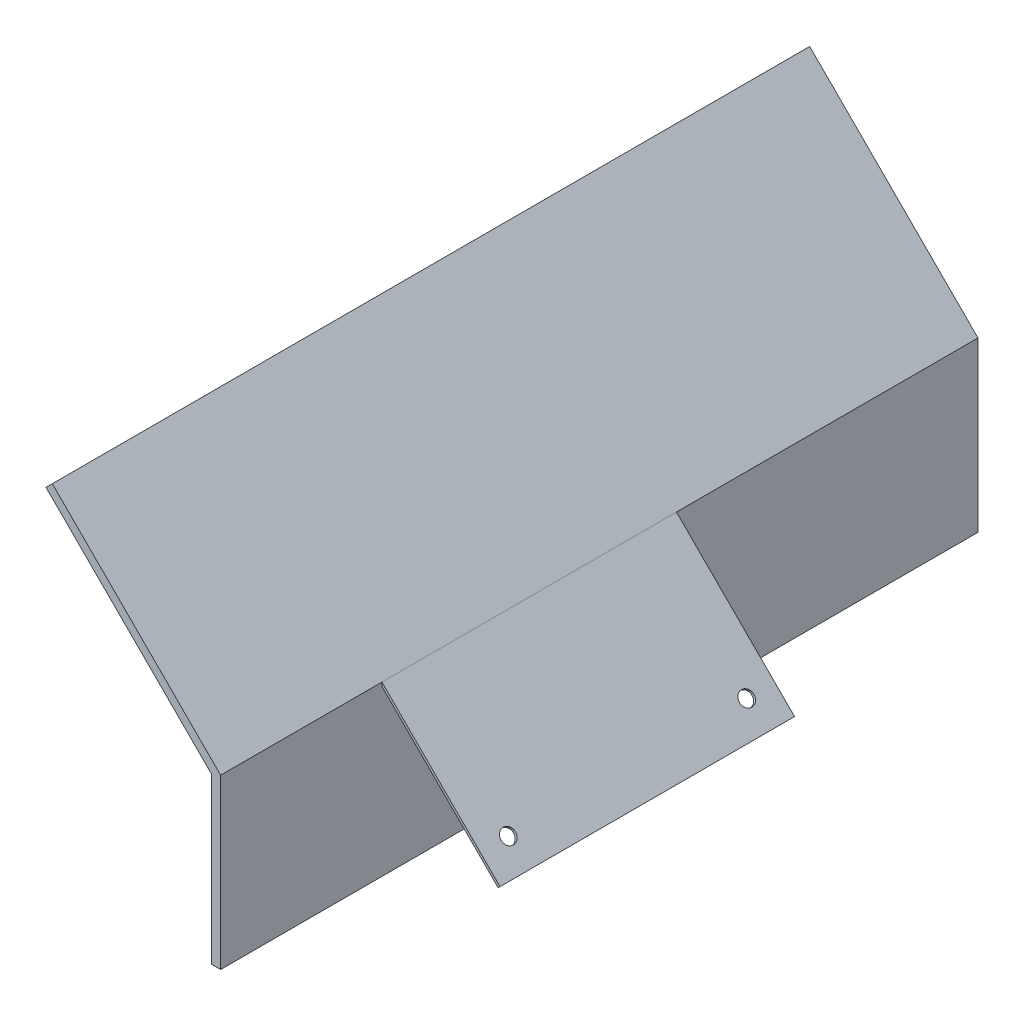
ISO-10303-21;
HEADER;
FILE_DESCRIPTION(('STEP AP214'),'2;1');
FILE_NAME('part.step','',(''),(''),'','','');
FILE_SCHEMA(('AUTOMOTIVE_DESIGN { 1 0 10303 214 1 1 1 1 }'));
ENDSEC;
DATA;
#1=APPLICATION_CONTEXT('core data for automotive mechanical design processes');
#2=APPLICATION_PROTOCOL_DEFINITION('international standard','automotive_design',2000,#1);
#3=PRODUCT_CONTEXT('',#1,'mechanical');
#4=PRODUCT('Part','Part','',(#3));
#5=PRODUCT_RELATED_PRODUCT_CATEGORY('part','',(#4));
#6=PRODUCT_DEFINITION_FORMATION('','',#4);
#7=PRODUCT_DEFINITION_CONTEXT('part definition',#1,'design');
#8=PRODUCT_DEFINITION('design','',#6,#7);
#9=PRODUCT_DEFINITION_SHAPE('','',#8);
#10=(LENGTH_UNIT() NAMED_UNIT(*) SI_UNIT(.MILLI.,.METRE.));
#11=(NAMED_UNIT(*) PLANE_ANGLE_UNIT() SI_UNIT($,.RADIAN.));
#12=(NAMED_UNIT(*) SI_UNIT($,.STERADIAN.) SOLID_ANGLE_UNIT());
#13=UNCERTAINTY_MEASURE_WITH_UNIT(LENGTH_MEASURE(1.E-05),#10,'distance_accuracy_value','');
#14=(GEOMETRIC_REPRESENTATION_CONTEXT(3) GLOBAL_UNCERTAINTY_ASSIGNED_CONTEXT((#13)) GLOBAL_UNIT_ASSIGNED_CONTEXT((#10,
#11,#12)) REPRESENTATION_CONTEXT('',''));
#15=CARTESIAN_POINT('',(0.,0.,0.));
#16=DIRECTION('',(0.,0.,1.));
#17=DIRECTION('',(1.,0.,0.));
#18=AXIS2_PLACEMENT_3D('',#15,#16,#17);
#19=CARTESIAN_POINT('',(-44.1236816385379,-78.9253169424674,-73.025));
#20=DIRECTION('',(0.,0.,-1.));
#21=DIRECTION('',(-0.707106781186546,-0.707106781186549,0.));
#22=AXIS2_PLACEMENT_3D('',#19,#20,#21);
#23=PLANE('',#22);
#24=DIRECTION('',(-0.707106781186549,0.707106781186546,0.));
#25=VECTOR('',#24,1.);
#26=CARTESIAN_POINT('',(57.5328176519647,22.7311823480355,-73.025));
#27=LINE('',#26,#25);
#28=CARTESIAN_POINT('',(57.5328176519647,22.7311823480355,-73.025));
#29=VERTEX_POINT('',#28);
#30=CARTESIAN_POINT('',(3.33641809728114,76.9275819027189,-73.025));
#31=VERTEX_POINT('',#30);
#32=EDGE_CURVE('E186',#29,#31,#27,.T.);
#33=ORIENTED_EDGE('',*,*,#32,.T.);
#34=DIRECTION('',(1.,0.,0.));
#35=VECTOR('',#34,1.);
#36=CARTESIAN_POINT('',(-139.7,76.9275819027189,-73.025));
#37=LINE('',#36,#35);
#38=CARTESIAN_POINT('',(1.61939312693272,76.9275819027189,-73.025));
#39=VERTEX_POINT('',#38);
#40=EDGE_CURVE('E150',#39,#31,#37,.T.);
#41=ORIENTED_EDGE('',*,*,#40,.F.);
#42=DIRECTION('',(-0.707106781186549,0.707106781186546,0.));
#43=VECTOR('',#42,1.);
#44=CARTESIAN_POINT('',(56.6743051667905,21.8726698628613,-73.025));
#45=LINE('',#44,#43);
#46=CARTESIAN_POINT('',(56.6743051667905,21.8726698628613,-73.025));
#47=VERTEX_POINT('',#46);
#48=EDGE_CURVE('E149',#47,#39,#45,.T.);
#49=ORIENTED_EDGE('',*,*,#48,.F.);
#50=DIRECTION('',(0.707106781186546,0.707106781186549,0.));
#51=VECTOR('',#50,1.);
#52=CARTESIAN_POINT('',(-44.1236816385379,-78.9253169424674,-73.025));
#53=LINE('',#52,#51);
#54=EDGE_CURVE('E183',#47,#29,#53,.T.);
#55=ORIENTED_EDGE('',*,*,#54,.T.);
#56=EDGE_LOOP('',(#33,#41,#49,#55));
#57=FACE_BOUND('',#56,.T.);
#58=ADVANCED_FACE('F59',(#57),#23,.F.);
#59=CARTESIAN_POINT('',(57.5328176519647,22.7311823480355,-342.9));
#60=DIRECTION('',(-0.707106781186549,0.707106781186546,0.));
#61=DIRECTION('',(0.,0.,1.));
#62=AXIS2_PLACEMENT_3D('',#59,#60,#61);
#63=PLANE('',#62);
#64=DIRECTION('',(0.707106781186546,0.707106781186549,0.));
#65=VECTOR('',#64,1.);
#66=CARTESIAN_POINT('',(-44.1236816385379,-78.9253169424675,-206.375));
#67=LINE('',#66,#65);
#68=CARTESIAN_POINT('',(56.6743051667905,21.8726698628613,-206.375));
#69=VERTEX_POINT('',#68);
#70=CARTESIAN_POINT('',(57.5328176519647,22.7311823480355,-206.375));
#71=VERTEX_POINT('',#70);
#72=EDGE_CURVE('E177',#69,#71,#67,.T.);
#73=ORIENTED_EDGE('',*,*,#72,.T.);
#74=DIRECTION('',(0.,0.,1.));
#75=VECTOR('',#74,1.);
#76=CARTESIAN_POINT('',(57.5328176519647,22.7311823480355,-342.9));
#77=LINE('',#76,#75);
#78=EDGE_CURVE('E13',#71,#29,#77,.T.);
#79=ORIENTED_EDGE('',*,*,#78,.T.);
#80=ORIENTED_EDGE('',*,*,#54,.F.);
#81=DIRECTION('',(0.,0.,1.));
#82=VECTOR('',#81,1.);
#83=CARTESIAN_POINT('',(56.6743051667905,21.8726698628613,-342.9));
#84=LINE('',#83,#82);
#85=EDGE_CURVE('E63',#69,#47,#84,.T.);
#86=ORIENTED_EDGE('',*,*,#85,.F.);
#87=EDGE_LOOP('',(#73,#79,#80,#86));
#88=FACE_BOUND('',#87,.T.);
#89=ADVANCED_FACE('F226',(#88),#63,.F.);
#90=CARTESIAN_POINT('',(4.06400000000002,76.2,-342.9));
#91=DIRECTION('',(0.707106781186546,0.707106781186549,0.));
#92=DIRECTION('',(-0.707106781186549,0.707106781186546,0.));
#93=AXIS2_PLACEMENT_3D('',#90,#91,#92);
#94=PLANE('',#93);
#95=CARTESIAN_POINT('',(48.5525615308955,31.7114384691047,-193.675));
#96=DIRECTION('',(0.707106781186546,0.707106781186549,0.));
#97=DIRECTION('',(-0.707106781186549,0.707106781186546,0.));
#98=AXIS2_PLACEMENT_3D('',#95,#96,#97);
#99=CIRCLE('',#98,3.26389999999998);
#100=CARTESIAN_POINT('',(46.2446357077808,34.0193642922194,-193.675));
#101=VERTEX_POINT('',#100);
#102=EDGE_CURVE('E174',#101,#101,#99,.T.);
#103=ORIENTED_EDGE('',*,*,#102,.F.);
#104=EDGE_LOOP('',(#103));
#105=FACE_BOUND('',#104,.T.);
#106=CARTESIAN_POINT('',(48.5525615308955,31.7114384691047,-85.725));
#107=DIRECTION('',(0.707106781186546,0.707106781186549,0.));
#108=DIRECTION('',(-0.707106781186549,0.707106781186546,0.));
#109=AXIS2_PLACEMENT_3D('',#106,#107,#108);
#110=CIRCLE('',#109,3.26389999999999);
#111=CARTESIAN_POINT('',(46.2446357077808,34.0193642922194,-85.725));
#112=VERTEX_POINT('',#111);
#113=EDGE_CURVE('E167',#112,#112,#110,.T.);
#114=ORIENTED_EDGE('',*,*,#113,.F.);
#115=EDGE_LOOP('',(#114));
#116=FACE_BOUND('',#115,.T.);
#117=DIRECTION('',(0.707106781186549,-0.707106781186546,0.));
#118=VECTOR('',#117,1.);
#119=CARTESIAN_POINT('',(57.5328176519647,22.7311823480355,-206.375));
#120=LINE('',#119,#118);
#121=CARTESIAN_POINT('',(3.33641809728114,76.9275819027189,-206.375));
#122=VERTEX_POINT('',#121);
#123=EDGE_CURVE('E181',#122,#71,#120,.T.);
#124=ORIENTED_EDGE('',*,*,#123,.F.);
#125=DIRECTION('',(0.,0.,1.));
#126=VECTOR('',#125,1.);
#127=CARTESIAN_POINT('',(3.33641809728114,76.9275819027189,-342.9));
#128=LINE('',#127,#126);
#129=CARTESIAN_POINT('',(3.33641809728114,76.9275819027189,-279.4));
#130=VERTEX_POINT('',#129);
#131=EDGE_CURVE('E191',#122,#130,#128,.F.);
#132=ORIENTED_EDGE('',*,*,#131,.T.);
#133=DIRECTION('',(0.707106781186549,-0.707106781186546,0.));
#134=VECTOR('',#133,1.);
#135=CARTESIAN_POINT('',(4.06400000000002,76.2,-279.4));
#136=LINE('',#135,#134);
#137=CARTESIAN_POINT('',(-72.1360000000002,152.4,-279.4));
#138=VERTEX_POINT('',#137);
#139=EDGE_CURVE('E155',#138,#130,#136,.T.);
#140=ORIENTED_EDGE('',*,*,#139,.F.);
#141=DIRECTION('',(0.,0.,1.));
#142=VECTOR('',#141,1.);
#143=CARTESIAN_POINT('',(-72.1360000000002,152.4,-342.9));
#144=LINE('',#143,#142);
#145=CARTESIAN_POINT('',(-72.1360000000002,152.4,-25.4));
#146=VERTEX_POINT('',#145);
#147=EDGE_CURVE('E171',#138,#146,#144,.T.);
#148=ORIENTED_EDGE('',*,*,#147,.T.);
#149=DIRECTION('',(-0.707106781186549,0.707106781186546,0.));
#150=VECTOR('',#149,1.);
#151=CARTESIAN_POINT('',(4.06400000000004,76.2,-25.4));
#152=LINE('',#151,#150);
#153=CARTESIAN_POINT('',(3.33641809728115,76.9275819027189,-25.4));
#154=VERTEX_POINT('',#153);
#155=EDGE_CURVE('E145',#154,#146,#152,.T.);
#156=ORIENTED_EDGE('',*,*,#155,.F.);
#157=EDGE_CURVE('E144',#154,#31,#128,.F.);
#158=ORIENTED_EDGE('',*,*,#157,.T.);
#159=ORIENTED_EDGE('',*,*,#32,.F.);
#160=ORIENTED_EDGE('',*,*,#78,.F.);
#161=EDGE_LOOP('',(#124,#132,#140,#148,#156,#158,#159,#160));
#162=FACE_BOUND('',#161,.T.);
#163=ADVANCED_FACE('F61',(#105,#116,#162),#94,.T.);
#164=CARTESIAN_POINT('',(56.6743051667905,21.8726698628613,-342.9));
#165=DIRECTION('',(0.707106781186546,0.707106781186549,0.));
#166=DIRECTION('',(-0.707106781186549,0.707106781186546,0.));
#167=AXIS2_PLACEMENT_3D('',#164,#165,#166);
#168=PLANE('',#167);
#169=CARTESIAN_POINT('',(47.6940490457213,30.8529259839304,-193.675));
#170=DIRECTION('',(-0.707106781186546,-0.707106781186549,0.));
#171=DIRECTION('',(0.707106781186549,-0.707106781186546,0.));
#172=AXIS2_PLACEMENT_3D('',#169,#170,#171);
#173=CIRCLE('',#172,3.26389999999998);
#174=CARTESIAN_POINT('',(50.0019748688361,28.5450001608157,-193.675));
#175=VERTEX_POINT('',#174);
#176=EDGE_CURVE('E164',#175,#175,#173,.T.);
#177=ORIENTED_EDGE('',*,*,#176,.F.);
#178=EDGE_LOOP('',(#177));
#179=FACE_BOUND('',#178,.T.);
#180=CARTESIAN_POINT('',(47.6940490457213,30.8529259839304,-85.725));
#181=DIRECTION('',(-0.707106781186546,-0.707106781186549,0.));
#182=DIRECTION('',(0.707106781186549,-0.707106781186546,0.));
#183=AXIS2_PLACEMENT_3D('',#180,#181,#182);
#184=CIRCLE('',#183,3.26389999999999);
#185=CARTESIAN_POINT('',(50.0019748688361,28.5450001608157,-85.725));
#186=VERTEX_POINT('',#185);
#187=EDGE_CURVE('E168',#186,#186,#184,.T.);
#188=ORIENTED_EDGE('',*,*,#187,.F.);
#189=EDGE_LOOP('',(#188));
#190=FACE_BOUND('',#189,.T.);
#191=ORIENTED_EDGE('',*,*,#48,.T.);
#192=DIRECTION('',(0.,0.,-1.));
#193=VECTOR('',#192,1.);
#194=CARTESIAN_POINT('',(1.61939312693272,76.9275819027189,-342.9));
#195=LINE('',#194,#193);
#196=CARTESIAN_POINT('',(1.61939312693272,76.9275819027189,-25.4));
#197=VERTEX_POINT('',#196);
#198=EDGE_CURVE('E141',#197,#39,#195,.T.);
#199=ORIENTED_EDGE('',*,*,#198,.F.);
#200=DIRECTION('',(-0.707106781186549,0.707106781186546,0.));
#201=VECTOR('',#200,1.);
#202=CARTESIAN_POINT('',(3.20548751482583,75.3414875148258,-25.4));
#203=LINE('',#202,#201);
#204=CARTESIAN_POINT('',(-72.9945124851744,151.541487514826,-25.4));
#205=VERTEX_POINT('',#204);
#206=EDGE_CURVE('E123',#197,#205,#203,.T.);
#207=ORIENTED_EDGE('',*,*,#206,.T.);
#208=DIRECTION('',(0.,0.,1.));
#209=VECTOR('',#208,1.);
#210=CARTESIAN_POINT('',(-72.9945124851745,151.541487514826,-342.9));
#211=LINE('',#210,#209);
#212=CARTESIAN_POINT('',(-72.9945124851745,151.541487514826,-279.4));
#213=VERTEX_POINT('',#212);
#214=EDGE_CURVE('E162',#213,#205,#211,.T.);
#215=ORIENTED_EDGE('',*,*,#214,.F.);
#216=DIRECTION('',(0.707106781186549,-0.707106781186546,0.));
#217=VECTOR('',#216,1.);
#218=CARTESIAN_POINT('',(3.20548751482581,75.3414875148258,-279.4));
#219=LINE('',#218,#217);
#220=CARTESIAN_POINT('',(1.61939312693272,76.9275819027189,-279.4));
#221=VERTEX_POINT('',#220);
#222=EDGE_CURVE('E133',#213,#221,#219,.T.);
#223=ORIENTED_EDGE('',*,*,#222,.T.);
#224=DIRECTION('',(0.,0.,1.));
#225=VECTOR('',#224,1.);
#226=CARTESIAN_POINT('',(1.61939312693272,76.9275819027189,-342.9));
#227=LINE('',#226,#225);
#228=CARTESIAN_POINT('',(1.61939312693273,76.9275819027189,-206.375));
#229=VERTEX_POINT('',#228);
#230=EDGE_CURVE('E146',#221,#229,#227,.T.);
#231=ORIENTED_EDGE('',*,*,#230,.T.);
#232=DIRECTION('',(0.707106781186549,-0.707106781186546,0.));
#233=VECTOR('',#232,1.);
#234=CARTESIAN_POINT('',(56.6743051667905,21.8726698628613,-206.375));
#235=LINE('',#234,#233);
#236=EDGE_CURVE('E179',#229,#69,#235,.T.);
#237=ORIENTED_EDGE('',*,*,#236,.T.);
#238=ORIENTED_EDGE('',*,*,#85,.T.);
#239=EDGE_LOOP('',(#191,#199,#207,#215,#223,#231,#237,#238));
#240=FACE_BOUND('',#239,.T.);
#241=ADVANCED_FACE('F148',(#179,#190,#240),#168,.F.);
#242=CARTESIAN_POINT('',(-44.1236816385379,-78.9253169424675,-206.375));
#243=DIRECTION('',(0.,0.,1.));
#244=DIRECTION('',(0.707106781186546,0.707106781186549,0.));
#245=AXIS2_PLACEMENT_3D('',#242,#243,#244);
#246=PLANE('',#245);
#247=ORIENTED_EDGE('',*,*,#236,.F.);
#248=DIRECTION('',(1.,0.,0.));
#249=VECTOR('',#248,1.);
#250=CARTESIAN_POINT('',(-139.7,76.9275819027189,-206.375));
#251=LINE('',#250,#249);
#252=EDGE_CURVE('E134',#229,#122,#251,.T.);
#253=ORIENTED_EDGE('',*,*,#252,.T.);
#254=ORIENTED_EDGE('',*,*,#123,.T.);
#255=ORIENTED_EDGE('',*,*,#72,.F.);
#256=EDGE_LOOP('',(#247,#253,#254,#255));
#257=FACE_BOUND('',#256,.T.);
#258=ADVANCED_FACE('F205',(#257),#246,.F.);
#259=CARTESIAN_POINT('',(254.239939830311,237.398816768521,-85.725));
#260=DIRECTION('',(-0.707106781186546,-0.707106781186549,0.));
#261=DIRECTION('',(0.707106781186549,-0.707106781186546,0.));
#262=AXIS2_PLACEMENT_3D('',#259,#260,#261);
#263=CYLINDRICAL_SURFACE('',#262,3.26389999999999);
#264=ORIENTED_EDGE('',*,*,#113,.T.);
#265=EDGE_LOOP('',(#264));
#266=FACE_BOUND('',#265,.T.);
#267=ORIENTED_EDGE('',*,*,#187,.T.);
#268=EDGE_LOOP('',(#267));
#269=FACE_BOUND('',#268,.T.);
#270=ADVANCED_FACE('F235',(#266,#269),#263,.F.);
#271=CARTESIAN_POINT('',(254.239939830311,237.398816768521,-193.675));
#272=DIRECTION('',(-0.707106781186546,-0.707106781186549,0.));
#273=DIRECTION('',(0.707106781186549,-0.707106781186546,0.));
#274=AXIS2_PLACEMENT_3D('',#271,#272,#273);
#275=CYLINDRICAL_SURFACE('',#274,3.26389999999998);
#276=ORIENTED_EDGE('',*,*,#102,.T.);
#277=EDGE_LOOP('',(#276));
#278=FACE_BOUND('',#277,.T.);
#279=ORIENTED_EDGE('',*,*,#176,.T.);
#280=EDGE_LOOP('',(#279));
#281=FACE_BOUND('',#280,.T.);
#282=ADVANCED_FACE('F223',(#278,#281),#275,.F.);
#283=CARTESIAN_POINT('',(-72.1360000000002,152.4,-342.9));
#284=DIRECTION('',(-0.707106781186549,0.707106781186546,0.));
#285=DIRECTION('',(0.,0.,1.));
#286=AXIS2_PLACEMENT_3D('',#283,#284,#285);
#287=PLANE('',#286);
#288=DIRECTION('',(-0.707106781186546,-0.707106781186549,0.));
#289=VECTOR('',#288,1.);
#290=CARTESIAN_POINT('',(-72.1360000000003,152.4,-25.4));
#291=LINE('',#290,#289);
#292=EDGE_CURVE('E129',#146,#205,#291,.T.);
#293=ORIENTED_EDGE('',*,*,#292,.F.);
#294=ORIENTED_EDGE('',*,*,#147,.F.);
#295=DIRECTION('',(0.707106781186546,0.707106781186549,0.));
#296=VECTOR('',#295,1.);
#297=CARTESIAN_POINT('',(-72.1360000000002,152.4,-279.4));
#298=LINE('',#297,#296);
#299=EDGE_CURVE('E160',#213,#138,#298,.T.);
#300=ORIENTED_EDGE('',*,*,#299,.F.);
#301=ORIENTED_EDGE('',*,*,#214,.T.);
#302=EDGE_LOOP('',(#293,#294,#300,#301));
#303=FACE_BOUND('',#302,.T.);
#304=ADVANCED_FACE('F214',(#303),#287,.T.);
#305=CARTESIAN_POINT('',(-75.0096819587424,76.9275819027189,-279.4));
#306=DIRECTION('',(0.,0.,1.));
#307=DIRECTION('',(1.,0.,0.));
#308=AXIS2_PLACEMENT_3D('',#305,#306,#307);
#309=PLANE('',#308);
#310=ORIENTED_EDGE('',*,*,#299,.T.);
#311=ORIENTED_EDGE('',*,*,#139,.T.);
#312=DIRECTION('',(1.,0.,0.));
#313=VECTOR('',#312,1.);
#314=CARTESIAN_POINT('',(-139.7,76.9275819027189,-279.4));
#315=LINE('',#314,#313);
#316=EDGE_CURVE('E151',#221,#130,#315,.T.);
#317=ORIENTED_EDGE('',*,*,#316,.F.);
#318=ORIENTED_EDGE('',*,*,#222,.F.);
#319=EDGE_LOOP('',(#310,#311,#317,#318));
#320=FACE_BOUND('',#319,.T.);
#321=ADVANCED_FACE('F215',(#320),#309,.F.);
#322=CARTESIAN_POINT('',(-139.7,76.9275819027189,-292.1));
#323=DIRECTION('',(0.,1.,0.));
#324=DIRECTION('',(0.,0.,1.));
#325=AXIS2_PLACEMENT_3D('',#322,#323,#324);
#326=PLANE('',#325);
#327=ORIENTED_EDGE('',*,*,#230,.F.);
#328=ORIENTED_EDGE('',*,*,#316,.T.);
#329=ORIENTED_EDGE('',*,*,#131,.F.);
#330=ORIENTED_EDGE('',*,*,#252,.F.);
#331=EDGE_LOOP('',(#327,#328,#329,#330));
#332=FACE_BOUND('',#331,.T.);
#333=ADVANCED_FACE('F208',(#332),#326,.F.);
#334=CARTESIAN_POINT('',(-139.7,76.9275819027189,0.));
#335=DIRECTION('',(0.,-1.,0.));
#336=DIRECTION('',(0.,0.,-1.));
#337=AXIS2_PLACEMENT_3D('',#334,#335,#336);
#338=PLANE('',#337);
#339=DIRECTION('',(1.,0.,0.));
#340=VECTOR('',#339,1.);
#341=CARTESIAN_POINT('',(-139.7,76.9275819027189,-25.4));
#342=LINE('',#341,#340);
#343=EDGE_CURVE('E126',#197,#154,#342,.T.);
#344=ORIENTED_EDGE('',*,*,#343,.F.);
#345=ORIENTED_EDGE('',*,*,#198,.T.);
#346=ORIENTED_EDGE('',*,*,#40,.T.);
#347=ORIENTED_EDGE('',*,*,#157,.F.);
#348=EDGE_LOOP('',(#344,#345,#346,#347));
#349=FACE_BOUND('',#348,.T.);
#350=ADVANCED_FACE('F139',(#349),#338,.T.);
#351=CARTESIAN_POINT('',(-75.0096819587424,152.4,-25.4));
#352=DIRECTION('',(0.,0.,-1.));
#353=DIRECTION('',(0.,1.,0.));
#354=AXIS2_PLACEMENT_3D('',#351,#352,#353);
#355=PLANE('',#354);
#356=ORIENTED_EDGE('',*,*,#343,.T.);
#357=ORIENTED_EDGE('',*,*,#155,.T.);
#358=ORIENTED_EDGE('',*,*,#292,.T.);
#359=ORIENTED_EDGE('',*,*,#206,.F.);
#360=EDGE_LOOP('',(#356,#357,#358,#359));
#361=FACE_BOUND('',#360,.T.);
#362=ADVANCED_FACE('F125',(#361),#355,.F.);
#363=CLOSED_SHELL('',(#58,#89,#163,#241,#258,#270,#282,#304,#321,#333,#350,#362));
#364=MANIFOLD_SOLID_BREP('B2',#363);
#365=CARTESIAN_POINT('',(0.,74.5166360825157,-342.9));
#366=DIRECTION('',(-1.,0.,0.));
#367=DIRECTION('',(0.,0.,1.));
#368=AXIS2_PLACEMENT_3D('',#365,#366,#367);
#369=PLANE('',#368);
#370=DIRECTION('',(0.,-1.,0.));
#371=VECTOR('',#370,1.);
#372=CARTESIAN_POINT('',(0.,74.5166360825157,0.));
#373=LINE('',#372,#371);
#374=CARTESIAN_POINT('',(0.,74.5166360825157,0.));
#375=VERTEX_POINT('',#374);
#376=CARTESIAN_POINT('',(0.,0.,0.));
#377=VERTEX_POINT('',#376);
#378=EDGE_CURVE('E463',#375,#377,#373,.T.);
#379=ORIENTED_EDGE('',*,*,#378,.F.);
#380=DIRECTION('',(0.,0.,1.));
#381=VECTOR('',#380,1.);
#382=CARTESIAN_POINT('',(0.,74.5166360825157,-342.9));
#383=LINE('',#382,#381);
#384=CARTESIAN_POINT('',(0.,74.5166360825157,-342.9));
#385=VERTEX_POINT('',#384);
#386=EDGE_CURVE('E57',#385,#375,#383,.T.);
#387=ORIENTED_EDGE('',*,*,#386,.F.);
#388=DIRECTION('',(0.,-1.,0.));
#389=VECTOR('',#388,1.);
#390=CARTESIAN_POINT('',(0.,74.5166360825157,-342.9));
#391=LINE('',#390,#389);
#392=CARTESIAN_POINT('',(0.,0.,-342.9));
#393=VERTEX_POINT('',#392);
#394=EDGE_CURVE('E476',#385,#393,#391,.T.);
#395=ORIENTED_EDGE('',*,*,#394,.T.);
#396=DIRECTION('',(0.,0.,1.));
#397=VECTOR('',#396,1.);
#398=CARTESIAN_POINT('',(0.,0.,-342.9));
#399=LINE('',#398,#397);
#400=EDGE_CURVE('E377',#393,#377,#399,.T.);
#401=ORIENTED_EDGE('',*,*,#400,.T.);
#402=EDGE_LOOP('',(#379,#387,#395,#401));
#403=FACE_BOUND('',#402,.T.);
#404=ADVANCED_FACE('F374',(#403),#369,.T.);
#405=CARTESIAN_POINT('',(0.,74.5166360825157,-342.9));
#406=DIRECTION('',(-0.707106781186547,-0.707106781186548,0.));
#407=DIRECTION('',(0.707106781186548,-0.707106781186547,0.));
#408=AXIS2_PLACEMENT_3D('',#405,#406,#407);
#409=PLANE('',#408);
#410=DIRECTION('',(0.707106781186547,-0.707106781186547,0.));
#411=VECTOR('',#410,1.);
#412=CARTESIAN_POINT('',(0.,74.5166360825157,0.));
#413=LINE('',#412,#411);
#414=CARTESIAN_POINT('',(-75.0096819587424,149.526318041258,0.));
#415=VERTEX_POINT('',#414);
#416=EDGE_CURVE('E411',#415,#375,#413,.T.);
#417=ORIENTED_EDGE('',*,*,#416,.F.);
#418=DIRECTION('',(0.,0.,1.));
#419=VECTOR('',#418,1.);
#420=CARTESIAN_POINT('',(-75.0096819587424,149.526318041258,-342.9));
#421=LINE('',#420,#419);
#422=CARTESIAN_POINT('',(-75.0096819587424,149.526318041258,-342.9));
#423=VERTEX_POINT('',#422);
#424=EDGE_CURVE('E383',#423,#415,#421,.T.);
#425=ORIENTED_EDGE('',*,*,#424,.F.);
#426=DIRECTION('',(0.707106781186838,-0.707106781186257,0.));
#427=VECTOR('',#426,1.);
#428=CARTESIAN_POINT('',(-75.0096819587424,149.526318041258,-342.9));
#429=LINE('',#428,#427);
#430=EDGE_CURVE('E391',#423,#385,#429,.T.);
#431=ORIENTED_EDGE('',*,*,#430,.T.);
#432=ORIENTED_EDGE('',*,*,#386,.T.);
#433=EDGE_LOOP('',(#417,#425,#431,#432));
#434=FACE_BOUND('',#433,.T.);
#435=ADVANCED_FACE('F498',(#434),#409,.T.);
#436=CARTESIAN_POINT('',(-72.1360000000003,152.4,-342.9));
#437=DIRECTION('',(-0.707106781186551,0.707106781186544,0.));
#438=DIRECTION('',(-0.707106781186544,-0.707106781186551,0.));
#439=AXIS2_PLACEMENT_3D('',#436,#437,#438);
#440=PLANE('',#439);
#441=DIRECTION('',(-0.707106781186544,-0.707106781186551,0.));
#442=VECTOR('',#441,1.);
#443=CARTESIAN_POINT('',(-72.1360000000003,152.4,0.));
#444=LINE('',#443,#442);
#445=CARTESIAN_POINT('',(-72.1360000000003,152.4,0.));
#446=VERTEX_POINT('',#445);
#447=EDGE_CURVE('E436',#446,#415,#444,.T.);
#448=ORIENTED_EDGE('',*,*,#447,.F.);
#449=DIRECTION('',(0.,0.,1.));
#450=VECTOR('',#449,1.);
#451=CARTESIAN_POINT('',(-72.1360000000003,152.4,-342.9));
#452=LINE('',#451,#450);
#453=CARTESIAN_POINT('',(-72.1360000000003,152.4,-342.9));
#454=VERTEX_POINT('',#453);
#455=EDGE_CURVE('E431',#454,#446,#452,.T.);
#456=ORIENTED_EDGE('',*,*,#455,.F.);
#457=DIRECTION('',(-0.707106781186544,-0.707106781186551,0.));
#458=VECTOR('',#457,1.);
#459=CARTESIAN_POINT('',(-72.1360000000003,152.4,-342.9));
#460=LINE('',#459,#458);
#461=EDGE_CURVE('E434',#454,#423,#460,.T.);
#462=ORIENTED_EDGE('',*,*,#461,.T.);
#463=ORIENTED_EDGE('',*,*,#424,.T.);
#464=EDGE_LOOP('',(#448,#456,#462,#463));
#465=FACE_BOUND('',#464,.T.);
#466=ADVANCED_FACE('F433',(#465),#440,.T.);
#467=CARTESIAN_POINT('',(4.064,76.2,-342.9));
#468=DIRECTION('',(0.707106781186546,0.707106781186549,0.));
#469=DIRECTION('',(-0.707106781186549,0.707106781186546,0.));
#470=AXIS2_PLACEMENT_3D('',#467,#468,#469);
#471=PLANE('',#470);
#472=DIRECTION('',(-0.707106781186549,0.707106781186546,0.));
#473=VECTOR('',#472,1.);
#474=CARTESIAN_POINT('',(4.064,76.2,0.));
#475=LINE('',#474,#473);
#476=CARTESIAN_POINT('',(4.064,76.2,0.));
#477=VERTEX_POINT('',#476);
#478=EDGE_CURVE('E473',#477,#446,#475,.T.);
#479=ORIENTED_EDGE('',*,*,#478,.F.);
#480=DIRECTION('',(0.,0.,1.));
#481=VECTOR('',#480,1.);
#482=CARTESIAN_POINT('',(4.064,76.2,-342.9));
#483=LINE('',#482,#481);
#484=CARTESIAN_POINT('',(4.064,76.2,-342.9));
#485=VERTEX_POINT('',#484);
#486=EDGE_CURVE('E442',#485,#477,#483,.T.);
#487=ORIENTED_EDGE('',*,*,#486,.F.);
#488=DIRECTION('',(-0.707106781186549,0.707106781186546,0.));
#489=VECTOR('',#488,1.);
#490=CARTESIAN_POINT('',(4.064,76.2,-342.9));
#491=LINE('',#490,#489);
#492=EDGE_CURVE('E449',#485,#454,#491,.T.);
#493=ORIENTED_EDGE('',*,*,#492,.T.);
#494=ORIENTED_EDGE('',*,*,#455,.T.);
#495=EDGE_LOOP('',(#479,#487,#493,#494));
#496=FACE_BOUND('',#495,.T.);
#497=ADVANCED_FACE('F452',(#496),#471,.T.);
#498=CARTESIAN_POINT('',(4.06400000000001,0.,-342.9));
#499=DIRECTION('',(1.,0.,0.));
#500=DIRECTION('',(0.,1.,0.));
#501=AXIS2_PLACEMENT_3D('',#498,#499,#500);
#502=PLANE('',#501);
#503=DIRECTION('',(0.,1.,0.));
#504=VECTOR('',#503,1.);
#505=CARTESIAN_POINT('',(4.06400000000001,0.,0.));
#506=LINE('',#505,#504);
#507=CARTESIAN_POINT('',(4.06400000000001,0.,0.));
#508=VERTEX_POINT('',#507);
#509=EDGE_CURVE('E469',#508,#477,#506,.T.);
#510=ORIENTED_EDGE('',*,*,#509,.F.);
#511=DIRECTION('',(0.,0.,1.));
#512=VECTOR('',#511,1.);
#513=CARTESIAN_POINT('',(4.06400000000001,0.,-342.9));
#514=LINE('',#513,#512);
#515=CARTESIAN_POINT('',(4.06400000000001,0.,-342.9));
#516=VERTEX_POINT('',#515);
#517=EDGE_CURVE('E479',#516,#508,#514,.T.);
#518=ORIENTED_EDGE('',*,*,#517,.F.);
#519=DIRECTION('',(0.,1.,0.));
#520=VECTOR('',#519,1.);
#521=CARTESIAN_POINT('',(4.06400000000001,0.,-342.9));
#522=LINE('',#521,#520);
#523=EDGE_CURVE('E454',#516,#485,#522,.T.);
#524=ORIENTED_EDGE('',*,*,#523,.T.);
#525=ORIENTED_EDGE('',*,*,#486,.T.);
#526=EDGE_LOOP('',(#510,#518,#524,#525));
#527=FACE_BOUND('',#526,.T.);
#528=ADVANCED_FACE('F488',(#527),#502,.T.);
#529=CARTESIAN_POINT('',(0.,0.,-342.9));
#530=DIRECTION('',(0.,-1.,0.));
#531=DIRECTION('',(0.,0.,-1.));
#532=AXIS2_PLACEMENT_3D('',#529,#530,#531);
#533=PLANE('',#532);
#534=DIRECTION('',(1.,0.,0.));
#535=VECTOR('',#534,1.);
#536=CARTESIAN_POINT('',(0.,0.,0.));
#537=LINE('',#536,#535);
#538=EDGE_CURVE('E466',#377,#508,#537,.T.);
#539=ORIENTED_EDGE('',*,*,#538,.F.);
#540=ORIENTED_EDGE('',*,*,#400,.F.);
#541=DIRECTION('',(1.,0.,0.));
#542=VECTOR('',#541,1.);
#543=CARTESIAN_POINT('',(0.,0.,-342.9));
#544=LINE('',#543,#542);
#545=EDGE_CURVE('E458',#393,#516,#544,.T.);
#546=ORIENTED_EDGE('',*,*,#545,.T.);
#547=ORIENTED_EDGE('',*,*,#517,.T.);
#548=EDGE_LOOP('',(#539,#540,#546,#547));
#549=FACE_BOUND('',#548,.T.);
#550=ADVANCED_FACE('F484',(#549),#533,.T.);
#551=CARTESIAN_POINT('',(0.,0.,-342.9));
#552=DIRECTION('',(0.,0.,1.));
#553=DIRECTION('',(1.,0.,0.));
#554=AXIS2_PLACEMENT_3D('',#551,#552,#553);
#555=PLANE('',#554);
#556=ORIENTED_EDGE('',*,*,#394,.F.);
#557=ORIENTED_EDGE('',*,*,#430,.F.);
#558=ORIENTED_EDGE('',*,*,#461,.F.);
#559=ORIENTED_EDGE('',*,*,#492,.F.);
#560=ORIENTED_EDGE('',*,*,#523,.F.);
#561=ORIENTED_EDGE('',*,*,#545,.F.);
#562=EDGE_LOOP('',(#556,#557,#558,#559,#560,#561));
#563=FACE_BOUND('',#562,.T.);
#564=ADVANCED_FACE('F447',(#563),#555,.F.);
#565=CARTESIAN_POINT('',(0.,0.,0.));
#566=DIRECTION('',(0.,0.,1.));
#567=DIRECTION('',(1.,0.,0.));
#568=AXIS2_PLACEMENT_3D('',#565,#566,#567);
#569=PLANE('',#568);
#570=ORIENTED_EDGE('',*,*,#378,.T.);
#571=ORIENTED_EDGE('',*,*,#538,.T.);
#572=ORIENTED_EDGE('',*,*,#509,.T.);
#573=ORIENTED_EDGE('',*,*,#478,.T.);
#574=ORIENTED_EDGE('',*,*,#447,.T.);
#575=ORIENTED_EDGE('',*,*,#416,.T.);
#576=EDGE_LOOP('',(#570,#571,#572,#573,#574,#575));
#577=FACE_BOUND('',#576,.T.);
#578=ADVANCED_FACE('F486',(#577),#569,.T.);
#579=CLOSED_SHELL('',(#404,#435,#466,#497,#528,#550,#564,#578));
#580=MANIFOLD_SOLID_BREP('B7_NOT_SHOWN',#579);
#581=ADVANCED_BREP_SHAPE_REPRESENTATION('',(#18,#364,#580),#14);
#582=SHAPE_DEFINITION_REPRESENTATION(#9,#581);
ENDSEC;
END-ISO-10303-21;
